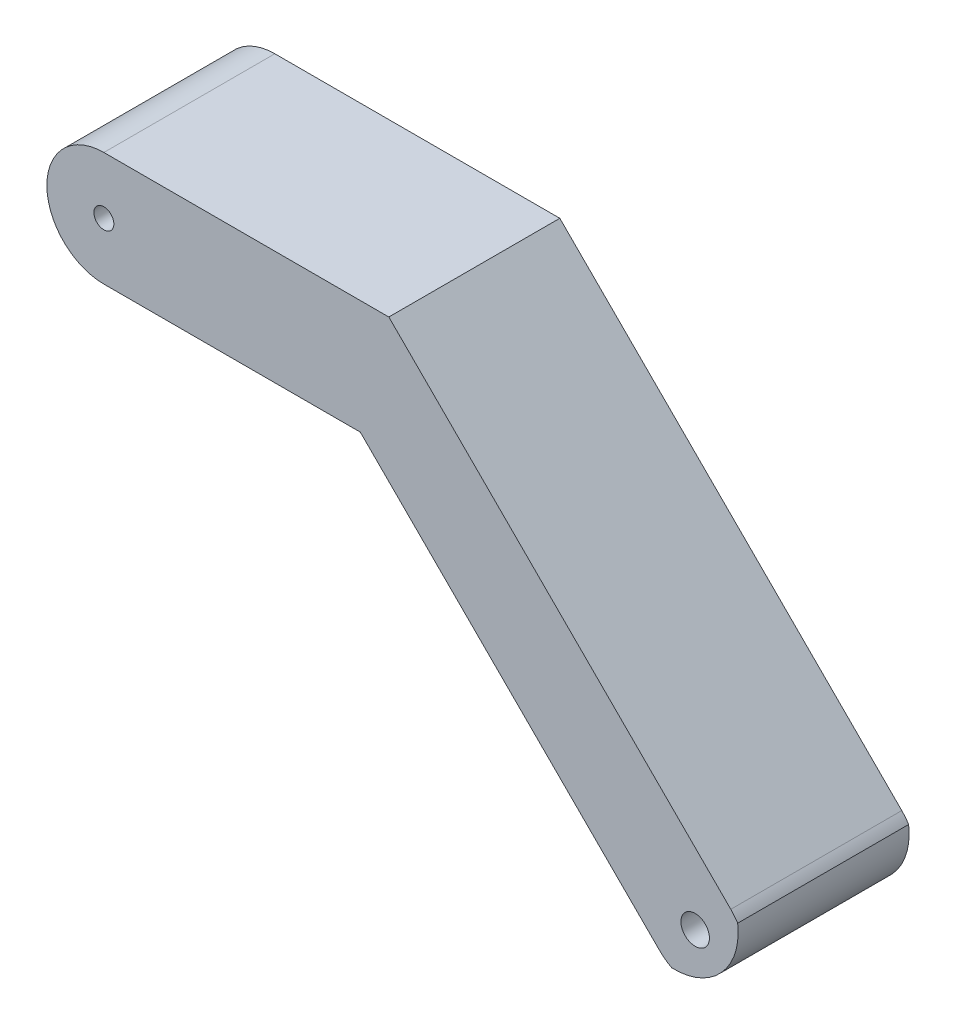
ISO-10303-21;
HEADER;
FILE_DESCRIPTION(('STEP AP214'),'2;1');
FILE_NAME('part.step','',(''),(''),'','','');
FILE_SCHEMA(('AUTOMOTIVE_DESIGN { 1 0 10303 214 1 1 1 1 }'));
ENDSEC;
DATA;
#1=APPLICATION_CONTEXT('core data for automotive mechanical design processes');
#2=APPLICATION_PROTOCOL_DEFINITION('international standard','automotive_design',2000,#1);
#3=PRODUCT_CONTEXT('',#1,'mechanical');
#4=PRODUCT('Part','Part','',(#3));
#5=PRODUCT_RELATED_PRODUCT_CATEGORY('part','',(#4));
#6=PRODUCT_DEFINITION_FORMATION('','',#4);
#7=PRODUCT_DEFINITION_CONTEXT('part definition',#1,'design');
#8=PRODUCT_DEFINITION('design','',#6,#7);
#9=PRODUCT_DEFINITION_SHAPE('','',#8);
#10=(LENGTH_UNIT() NAMED_UNIT(*) SI_UNIT(.MILLI.,.METRE.));
#11=(NAMED_UNIT(*) PLANE_ANGLE_UNIT() SI_UNIT($,.RADIAN.));
#12=(NAMED_UNIT(*) SI_UNIT($,.STERADIAN.) SOLID_ANGLE_UNIT());
#13=UNCERTAINTY_MEASURE_WITH_UNIT(LENGTH_MEASURE(1.E-05),#10,'distance_accuracy_value','');
#14=(GEOMETRIC_REPRESENTATION_CONTEXT(3) GLOBAL_UNCERTAINTY_ASSIGNED_CONTEXT((#13)) GLOBAL_UNIT_ASSIGNED_CONTEXT((#10,
#11,#12)) REPRESENTATION_CONTEXT('',''));
#15=CARTESIAN_POINT('',(0.,0.,0.));
#16=DIRECTION('',(0.,0.,1.));
#17=DIRECTION('',(1.,0.,0.));
#18=AXIS2_PLACEMENT_3D('',#15,#16,#17);
#19=CARTESIAN_POINT('',(0.,0.,15.));
#20=DIRECTION('',(0.,0.,1.));
#21=DIRECTION('',(1.,0.,0.));
#22=AXIS2_PLACEMENT_3D('',#19,#20,#21);
#23=PLANE('',#22);
#24=DIRECTION('',(-0.707106781186547,0.707106781186548,0.));
#25=VECTOR('',#24,1.);
#26=CARTESIAN_POINT('',(17.5,17.5,15.));
#27=LINE('',#26,#25);
#28=CARTESIAN_POINT('',(97.3564777291596,-62.3564777291598,15.));
#29=VERTEX_POINT('',#28);
#30=CARTESIAN_POINT('',(44.9999999999999,-9.99999999999999,15.));
#31=VERTEX_POINT('',#30);
#32=EDGE_CURVE('E39',#29,#31,#27,.T.);
#33=ORIENTED_EDGE('',*,*,#32,.F.);
#34=CARTESIAN_POINT('',(103.749176054311,-56.2508239456891,15.));
#35=DIRECTION('',(0.,0.,1.));
#36=DIRECTION('',(1.,0.,0.));
#37=AXIS2_PLACEMENT_3D('',#34,#35,#36);
#38=CIRCLE('',#37,8.84000000000001);
#39=CARTESIAN_POINT('',(99.6143424201691,-64.0641939495972,15.));
#40=VERTEX_POINT('',#39);
#41=EDGE_CURVE('E281',#29,#40,#38,.T.);
#42=ORIENTED_EDGE('',*,*,#41,.T.);
#43=CARTESIAN_POINT('',(100.091322311484,-52.8730647346689,15.));
#44=DIRECTION('',(0.,0.,1.));
#45=DIRECTION('',(1.,0.,0.));
#46=AXIS2_PLACEMENT_3D('',#43,#44,#45);
#47=CIRCLE('',#46,11.2012893419437);
#48=CARTESIAN_POINT('',(111.20911577039,-51.5079451329362,15.));
#49=VERTEX_POINT('',#48);
#50=EDGE_CURVE('E123',#40,#49,#47,.T.);
#51=ORIENTED_EDGE('',*,*,#50,.T.);
#52=CARTESIAN_POINT('',(110.,-50.,15.));
#53=VERTEX_POINT('',#52);
#54=EDGE_CURVE('E280',#49,#53,#38,.T.);
#55=ORIENTED_EDGE('',*,*,#54,.T.);
#56=DIRECTION('',(0.707106781186546,-0.707106781186549,0.));
#57=VECTOR('',#56,1.);
#58=CARTESIAN_POINT('',(30.0000000000001,30.,15.));
#59=LINE('',#58,#57);
#60=CARTESIAN_POINT('',(50.,10.,15.));
#61=VERTEX_POINT('',#60);
#62=EDGE_CURVE('E161',#61,#53,#59,.T.);
#63=ORIENTED_EDGE('',*,*,#62,.F.);
#64=DIRECTION('',(1.,0.,0.));
#65=VECTOR('',#64,1.);
#66=CARTESIAN_POINT('',(0.,10.,15.));
#67=LINE('',#66,#65);
#68=CARTESIAN_POINT('',(0.,10.,15.));
#69=VERTEX_POINT('',#68);
#70=EDGE_CURVE('E159',#69,#61,#67,.T.);
#71=ORIENTED_EDGE('',*,*,#70,.F.);
#72=CARTESIAN_POINT('',(0.,0.,15.));
#73=DIRECTION('',(0.,0.,1.));
#74=DIRECTION('',(1.,0.,0.));
#75=AXIS2_PLACEMENT_3D('',#72,#73,#74);
#76=CIRCLE('',#75,10.);
#77=CARTESIAN_POINT('',(0.,-10.,15.));
#78=VERTEX_POINT('',#77);
#79=EDGE_CURVE('E156',#69,#78,#76,.T.);
#80=ORIENTED_EDGE('',*,*,#79,.T.);
#81=DIRECTION('',(1.,0.,0.));
#82=VECTOR('',#81,1.);
#83=CARTESIAN_POINT('',(0.,-10.,15.));
#84=LINE('',#83,#82);
#85=EDGE_CURVE('E141',#78,#31,#84,.T.);
#86=ORIENTED_EDGE('',*,*,#85,.T.);
#87=EDGE_LOOP('',(#33,#42,#51,#55,#63,#71,#80,#86));
#88=FACE_BOUND('',#87,.T.);
#89=CARTESIAN_POINT('',(0.,0.,15.));
#90=DIRECTION('',(0.,0.,1.));
#91=DIRECTION('',(1.,0.,0.));
#92=AXIS2_PLACEMENT_3D('',#89,#90,#91);
#93=CIRCLE('',#92,1.75);
#94=CARTESIAN_POINT('',(1.75,0.,15.));
#95=VERTEX_POINT('',#94);
#96=EDGE_CURVE('E146',#95,#95,#93,.T.);
#97=ORIENTED_EDGE('',*,*,#96,.F.);
#98=EDGE_LOOP('',(#97));
#99=FACE_BOUND('',#98,.T.);
#100=CARTESIAN_POINT('',(103.749176054311,-56.2508239456891,15.));
#101=DIRECTION('',(0.,0.,1.));
#102=DIRECTION('',(1.,0.,0.));
#103=AXIS2_PLACEMENT_3D('',#100,#101,#102);
#104=CIRCLE('',#103,2.50000000000001);
#105=CARTESIAN_POINT('',(106.249176054311,-56.2508239456891,15.));
#106=VERTEX_POINT('',#105);
#107=EDGE_CURVE('E116',#106,#106,#104,.T.);
#108=ORIENTED_EDGE('',*,*,#107,.F.);
#109=EDGE_LOOP('',(#108));
#110=FACE_BOUND('',#109,.T.);
#111=ADVANCED_FACE('F35',(#88,#99,#110),#23,.T.);
#112=CARTESIAN_POINT('',(0.,0.,-15.));
#113=DIRECTION('',(0.,0.,1.));
#114=DIRECTION('',(1.,0.,0.));
#115=AXIS2_PLACEMENT_3D('',#112,#113,#114);
#116=PLANE('',#115);
#117=CARTESIAN_POINT('',(0.,0.,-15.));
#118=DIRECTION('',(0.,0.,1.));
#119=DIRECTION('',(1.,0.,0.));
#120=AXIS2_PLACEMENT_3D('',#117,#118,#119);
#121=CIRCLE('',#120,1.75);
#122=CARTESIAN_POINT('',(1.75,0.,-15.));
#123=VERTEX_POINT('',#122);
#124=EDGE_CURVE('E11',#123,#123,#121,.T.);
#125=ORIENTED_EDGE('',*,*,#124,.T.);
#126=EDGE_LOOP('',(#125));
#127=FACE_BOUND('',#126,.T.);
#128=DIRECTION('',(0.707106781186546,-0.707106781186549,0.));
#129=VECTOR('',#128,1.);
#130=CARTESIAN_POINT('',(30.0000000000001,30.,-15.));
#131=LINE('',#130,#129);
#132=CARTESIAN_POINT('',(50.,10.,-15.));
#133=VERTEX_POINT('',#132);
#134=CARTESIAN_POINT('',(110.,-50.,-15.));
#135=VERTEX_POINT('',#134);
#136=EDGE_CURVE('E152',#133,#135,#131,.T.);
#137=ORIENTED_EDGE('',*,*,#136,.T.);
#138=CARTESIAN_POINT('',(103.749176054311,-56.2508239456891,-15.));
#139=DIRECTION('',(0.,0.,1.));
#140=DIRECTION('',(1.,0.,0.));
#141=AXIS2_PLACEMENT_3D('',#138,#139,#140);
#142=CIRCLE('',#141,8.84000000000001);
#143=CARTESIAN_POINT('',(111.20911577039,-51.5079451329362,-15.));
#144=VERTEX_POINT('',#143);
#145=EDGE_CURVE('E115',#144,#135,#142,.T.);
#146=ORIENTED_EDGE('',*,*,#145,.F.);
#147=CARTESIAN_POINT('',(100.091322311484,-52.8730647346689,-15.));
#148=DIRECTION('',(0.,0.,1.));
#149=DIRECTION('',(1.,0.,0.));
#150=AXIS2_PLACEMENT_3D('',#147,#148,#149);
#151=CIRCLE('',#150,11.2012893419437);
#152=CARTESIAN_POINT('',(99.6143424201691,-64.0641939495972,-15.));
#153=VERTEX_POINT('',#152);
#154=EDGE_CURVE('E122',#153,#144,#151,.T.);
#155=ORIENTED_EDGE('',*,*,#154,.F.);
#156=CARTESIAN_POINT('',(97.3564777291596,-62.3564777291598,-15.));
#157=VERTEX_POINT('',#156);
#158=EDGE_CURVE('E106',#157,#153,#142,.T.);
#159=ORIENTED_EDGE('',*,*,#158,.F.);
#160=DIRECTION('',(-0.707106781186547,0.707106781186548,0.));
#161=VECTOR('',#160,1.);
#162=CARTESIAN_POINT('',(17.5,17.5,-15.));
#163=LINE('',#162,#161);
#164=CARTESIAN_POINT('',(44.9999999999999,-9.99999999999999,-15.));
#165=VERTEX_POINT('',#164);
#166=EDGE_CURVE('E45',#157,#165,#163,.T.);
#167=ORIENTED_EDGE('',*,*,#166,.T.);
#168=DIRECTION('',(1.,0.,0.));
#169=VECTOR('',#168,1.);
#170=CARTESIAN_POINT('',(0.,-10.,-15.));
#171=LINE('',#170,#169);
#172=CARTESIAN_POINT('',(0.,-10.,-15.));
#173=VERTEX_POINT('',#172);
#174=EDGE_CURVE('E142',#173,#165,#171,.T.);
#175=ORIENTED_EDGE('',*,*,#174,.F.);
#176=CARTESIAN_POINT('',(0.,0.,-15.));
#177=DIRECTION('',(0.,0.,1.));
#178=DIRECTION('',(1.,0.,0.));
#179=AXIS2_PLACEMENT_3D('',#176,#177,#178);
#180=CIRCLE('',#179,10.);
#181=CARTESIAN_POINT('',(0.,10.,-15.));
#182=VERTEX_POINT('',#181);
#183=EDGE_CURVE('E145',#182,#173,#180,.T.);
#184=ORIENTED_EDGE('',*,*,#183,.F.);
#185=DIRECTION('',(1.,0.,0.));
#186=VECTOR('',#185,1.);
#187=CARTESIAN_POINT('',(0.,10.,-15.));
#188=LINE('',#187,#186);
#189=EDGE_CURVE('E149',#182,#133,#188,.T.);
#190=ORIENTED_EDGE('',*,*,#189,.T.);
#191=EDGE_LOOP('',(#137,#146,#155,#159,#167,#175,#184,#190));
#192=FACE_BOUND('',#191,.T.);
#193=CARTESIAN_POINT('',(103.749176054311,-56.2508239456891,-15.));
#194=DIRECTION('',(0.,0.,1.));
#195=DIRECTION('',(1.,0.,0.));
#196=AXIS2_PLACEMENT_3D('',#193,#194,#195);
#197=CIRCLE('',#196,2.50000000000001);
#198=CARTESIAN_POINT('',(106.249176054311,-56.2508239456891,-15.));
#199=VERTEX_POINT('',#198);
#200=EDGE_CURVE('E134',#199,#199,#197,.T.);
#201=ORIENTED_EDGE('',*,*,#200,.T.);
#202=EDGE_LOOP('',(#201));
#203=FACE_BOUND('',#202,.T.);
#204=ADVANCED_FACE('F37',(#127,#192,#203),#116,.F.);
#205=CARTESIAN_POINT('',(17.5,17.5,15.));
#206=DIRECTION('',(-0.707106781186549,-0.707106781186547,0.));
#207=DIRECTION('',(0.707106781186547,-0.707106781186549,0.));
#208=AXIS2_PLACEMENT_3D('',#205,#206,#207);
#209=PLANE('',#208);
#210=ORIENTED_EDGE('',*,*,#166,.F.);
#211=DIRECTION('',(0.,0.,-1.));
#212=VECTOR('',#211,1.);
#213=CARTESIAN_POINT('',(97.3564777291596,-62.3564777291598,15.));
#214=LINE('',#213,#212);
#215=EDGE_CURVE('E113',#29,#157,#214,.T.);
#216=ORIENTED_EDGE('',*,*,#215,.F.);
#217=ORIENTED_EDGE('',*,*,#32,.T.);
#218=DIRECTION('',(0.,0.,-1.));
#219=VECTOR('',#218,1.);
#220=CARTESIAN_POINT('',(44.9999999999999,-9.99999999999999,15.));
#221=LINE('',#220,#219);
#222=EDGE_CURVE('E139',#31,#165,#221,.T.);
#223=ORIENTED_EDGE('',*,*,#222,.T.);
#224=EDGE_LOOP('',(#210,#216,#217,#223));
#225=FACE_BOUND('',#224,.T.);
#226=ADVANCED_FACE('F167',(#225),#209,.T.);
#227=CARTESIAN_POINT('',(30.0000000000001,30.,15.));
#228=DIRECTION('',(0.707106781186549,0.707106781186546,0.));
#229=DIRECTION('',(-0.707106781186546,0.707106781186549,0.));
#230=AXIS2_PLACEMENT_3D('',#227,#228,#229);
#231=PLANE('',#230);
#232=ORIENTED_EDGE('',*,*,#62,.T.);
#233=DIRECTION('',(0.,0.,-1.));
#234=VECTOR('',#233,1.);
#235=CARTESIAN_POINT('',(110.,-50.,15.));
#236=LINE('',#235,#234);
#237=EDGE_CURVE('E277',#53,#135,#236,.T.);
#238=ORIENTED_EDGE('',*,*,#237,.T.);
#239=ORIENTED_EDGE('',*,*,#136,.F.);
#240=DIRECTION('',(0.,0.,-1.));
#241=VECTOR('',#240,1.);
#242=CARTESIAN_POINT('',(50.,10.,15.));
#243=LINE('',#242,#241);
#244=EDGE_CURVE('E54',#61,#133,#243,.T.);
#245=ORIENTED_EDGE('',*,*,#244,.F.);
#246=EDGE_LOOP('',(#232,#238,#239,#245));
#247=FACE_BOUND('',#246,.T.);
#248=ADVANCED_FACE('F180',(#247),#231,.T.);
#249=CARTESIAN_POINT('',(0.,10.,15.));
#250=DIRECTION('',(0.,1.,0.));
#251=DIRECTION('',(-1.,0.,0.));
#252=AXIS2_PLACEMENT_3D('',#249,#250,#251);
#253=PLANE('',#252);
#254=ORIENTED_EDGE('',*,*,#189,.F.);
#255=DIRECTION('',(0.,0.,-1.));
#256=VECTOR('',#255,1.);
#257=CARTESIAN_POINT('',(0.,10.,15.));
#258=LINE('',#257,#256);
#259=EDGE_CURVE('E69',#69,#182,#258,.T.);
#260=ORIENTED_EDGE('',*,*,#259,.F.);
#261=ORIENTED_EDGE('',*,*,#70,.T.);
#262=ORIENTED_EDGE('',*,*,#244,.T.);
#263=EDGE_LOOP('',(#254,#260,#261,#262));
#264=FACE_BOUND('',#263,.T.);
#265=ADVANCED_FACE('F177',(#264),#253,.T.);
#266=CARTESIAN_POINT('',(0.,0.,15.));
#267=DIRECTION('',(0.,0.,-1.));
#268=DIRECTION('',(-1.,0.,0.));
#269=AXIS2_PLACEMENT_3D('',#266,#267,#268);
#270=CYLINDRICAL_SURFACE('',#269,10.);
#271=ORIENTED_EDGE('',*,*,#183,.T.);
#272=DIRECTION('',(0.,0.,-1.));
#273=VECTOR('',#272,1.);
#274=CARTESIAN_POINT('',(0.,-10.,15.));
#275=LINE('',#274,#273);
#276=EDGE_CURVE('E136',#78,#173,#275,.T.);
#277=ORIENTED_EDGE('',*,*,#276,.F.);
#278=ORIENTED_EDGE('',*,*,#79,.F.);
#279=ORIENTED_EDGE('',*,*,#259,.T.);
#280=EDGE_LOOP('',(#271,#277,#278,#279));
#281=FACE_BOUND('',#280,.T.);
#282=ADVANCED_FACE('F179',(#281),#270,.T.);
#283=CARTESIAN_POINT('',(0.,0.,15.));
#284=DIRECTION('',(0.,0.,-1.));
#285=DIRECTION('',(-1.,0.,0.));
#286=AXIS2_PLACEMENT_3D('',#283,#284,#285);
#287=CYLINDRICAL_SURFACE('',#286,1.75);
#288=ORIENTED_EDGE('',*,*,#96,.T.);
#289=EDGE_LOOP('',(#288));
#290=FACE_BOUND('',#289,.T.);
#291=ORIENTED_EDGE('',*,*,#124,.F.);
#292=EDGE_LOOP('',(#291));
#293=FACE_BOUND('',#292,.T.);
#294=ADVANCED_FACE('F186',(#290,#293),#287,.F.);
#295=CARTESIAN_POINT('',(0.,-10.,15.));
#296=DIRECTION('',(0.,1.,0.));
#297=DIRECTION('',(-1.,0.,0.));
#298=AXIS2_PLACEMENT_3D('',#295,#296,#297);
#299=PLANE('',#298);
#300=ORIENTED_EDGE('',*,*,#174,.T.);
#301=ORIENTED_EDGE('',*,*,#222,.F.);
#302=ORIENTED_EDGE('',*,*,#85,.F.);
#303=ORIENTED_EDGE('',*,*,#276,.T.);
#304=EDGE_LOOP('',(#300,#301,#302,#303));
#305=FACE_BOUND('',#304,.T.);
#306=ADVANCED_FACE('F174',(#305),#299,.F.);
#307=CARTESIAN_POINT('',(100.091322311484,-52.8730647346689,-15.01));
#308=DIRECTION('',(0.,0.,1.));
#309=DIRECTION('',(1.,0.,0.));
#310=AXIS2_PLACEMENT_3D('',#307,#308,#309);
#311=CYLINDRICAL_SURFACE('',#310,11.2012893419437);
#312=ORIENTED_EDGE('',*,*,#154,.T.);
#313=DIRECTION('',(0.,0.,1.));
#314=VECTOR('',#313,1.);
#315=CARTESIAN_POINT('',(111.20911577039,-51.5079451329362,-0.0049999999999998));
#316=LINE('',#315,#314);
#317=EDGE_CURVE('E124',#144,#49,#316,.T.);
#318=ORIENTED_EDGE('',*,*,#317,.T.);
#319=ORIENTED_EDGE('',*,*,#50,.F.);
#320=DIRECTION('',(0.,0.,1.));
#321=VECTOR('',#320,1.);
#322=CARTESIAN_POINT('',(99.6143424201691,-64.0641939495972,-0.0049999999999998));
#323=LINE('',#322,#321);
#324=EDGE_CURVE('E110',#40,#153,#323,.F.);
#325=ORIENTED_EDGE('',*,*,#324,.T.);
#326=EDGE_LOOP('',(#312,#318,#319,#325));
#327=FACE_BOUND('',#326,.T.);
#328=ADVANCED_FACE('F120',(#327),#311,.T.);
#329=CARTESIAN_POINT('',(103.749176054311,-56.2508239456891,15.));
#330=DIRECTION('',(0.,0.,-1.));
#331=DIRECTION('',(-1.,0.,0.));
#332=AXIS2_PLACEMENT_3D('',#329,#330,#331);
#333=CYLINDRICAL_SURFACE('',#332,8.84000000000001);
#334=ORIENTED_EDGE('',*,*,#324,.F.);
#335=ORIENTED_EDGE('',*,*,#41,.F.);
#336=ORIENTED_EDGE('',*,*,#215,.T.);
#337=ORIENTED_EDGE('',*,*,#158,.T.);
#338=EDGE_LOOP('',(#334,#335,#336,#337));
#339=FACE_BOUND('',#338,.T.);
#340=ADVANCED_FACE('F108',(#339),#333,.T.);
#341=ORIENTED_EDGE('',*,*,#317,.F.);
#342=ORIENTED_EDGE('',*,*,#145,.T.);
#343=ORIENTED_EDGE('',*,*,#237,.F.);
#344=ORIENTED_EDGE('',*,*,#54,.F.);
#345=EDGE_LOOP('',(#341,#342,#343,#344));
#346=FACE_BOUND('',#345,.T.);
#347=ADVANCED_FACE('F204',(#346),#333,.T.);
#348=CARTESIAN_POINT('',(103.749176054311,-56.2508239456891,15.));
#349=DIRECTION('',(0.,0.,-1.));
#350=DIRECTION('',(-1.,0.,0.));
#351=AXIS2_PLACEMENT_3D('',#348,#349,#350);
#352=CYLINDRICAL_SURFACE('',#351,2.50000000000001);
#353=ORIENTED_EDGE('',*,*,#107,.T.);
#354=EDGE_LOOP('',(#353));
#355=FACE_BOUND('',#354,.T.);
#356=ORIENTED_EDGE('',*,*,#200,.F.);
#357=EDGE_LOOP('',(#356));
#358=FACE_BOUND('',#357,.T.);
#359=ADVANCED_FACE('F196',(#355,#358),#352,.F.);
#360=CLOSED_SHELL('',(#111,#204,#226,#248,#265,#282,#294,#306,#328,#340,#347,#359));
#361=MANIFOLD_SOLID_BREP('B2',#360);
#362=ADVANCED_BREP_SHAPE_REPRESENTATION('',(#18,#361),#14);
#363=SHAPE_DEFINITION_REPRESENTATION(#9,#362);
ENDSEC;
END-ISO-10303-21;
